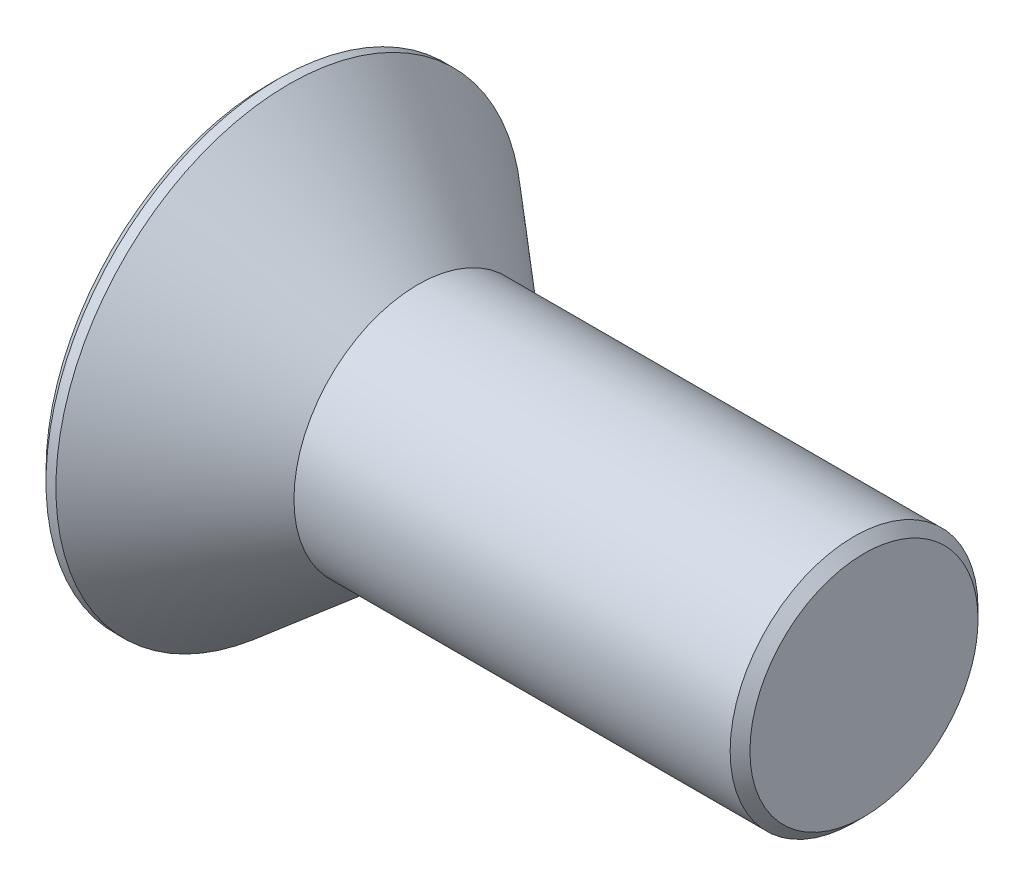
ISO-10303-21;
HEADER;
FILE_DESCRIPTION(('STEP AP214'),'2;1');
FILE_NAME('part.step','',(''),(''),'','','');
FILE_SCHEMA(('AUTOMOTIVE_DESIGN { 1 0 10303 214 1 1 1 1 }'));
ENDSEC;
DATA;
#1=APPLICATION_CONTEXT('core data for automotive mechanical design processes');
#2=APPLICATION_PROTOCOL_DEFINITION('international standard','automotive_design',2000,#1);
#3=PRODUCT_CONTEXT('',#1,'mechanical');
#4=PRODUCT('Part','Part','',(#3));
#5=PRODUCT_RELATED_PRODUCT_CATEGORY('part','',(#4));
#6=PRODUCT_DEFINITION_FORMATION('','',#4);
#7=PRODUCT_DEFINITION_CONTEXT('part definition',#1,'design');
#8=PRODUCT_DEFINITION('design','',#6,#7);
#9=PRODUCT_DEFINITION_SHAPE('','',#8);
#10=(LENGTH_UNIT() NAMED_UNIT(*) SI_UNIT(.MILLI.,.METRE.));
#11=(NAMED_UNIT(*) PLANE_ANGLE_UNIT() SI_UNIT($,.RADIAN.));
#12=(NAMED_UNIT(*) SI_UNIT($,.STERADIAN.) SOLID_ANGLE_UNIT());
#13=UNCERTAINTY_MEASURE_WITH_UNIT(LENGTH_MEASURE(1.E-05),#10,'distance_accuracy_value','');
#14=(GEOMETRIC_REPRESENTATION_CONTEXT(3) GLOBAL_UNCERTAINTY_ASSIGNED_CONTEXT((#13)) GLOBAL_UNIT_ASSIGNED_CONTEXT((#10,
#11,#12)) REPRESENTATION_CONTEXT('',''));
#15=CARTESIAN_POINT('',(0.,0.,0.));
#16=DIRECTION('',(0.,0.,1.));
#17=DIRECTION('',(1.,0.,0.));
#18=AXIS2_PLACEMENT_3D('',#15,#16,#17);
#19=CARTESIAN_POINT('',(1.2,0.,0.));
#20=DIRECTION('',(-1.,0.,0.));
#21=DIRECTION('',(0.,0.,1.));
#22=AXIS2_PLACEMENT_3D('',#19,#20,#21);
#23=PLANE('',#22);
#24=DIRECTION('',(0.,-0.500000000000017,-0.866025403784429));
#25=VECTOR('',#24,1.);
#26=CARTESIAN_POINT('',(1.2,-0.9566987298108,-0.5070508075689));
#27=LINE('',#26,#25);
#28=CARTESIAN_POINT('',(1.2,-0.956698729810804,-0.507050807568898));
#29=VERTEX_POINT('',#28);
#30=CARTESIAN_POINT('',(1.2,-0.736121593216791,-0.125000000000005));
#31=VERTEX_POINT('',#30);
#32=EDGE_CURVE('E1387',#29,#31,#27,.F.);
#33=ORIENTED_EDGE('',*,*,#32,.T.);
#34=CARTESIAN_POINT('',(1.2,-0.9526279441629,0.));
#35=DIRECTION('',(-1.,0.,0.));
#36=DIRECTION('',(0.,0.866025403784429,0.500000000000017));
#37=AXIS2_PLACEMENT_3D('',#34,#35,#36);
#38=CIRCLE('',#37,0.25);
#39=CARTESIAN_POINT('',(1.2,-0.736121593216798,0.125000000000001));
#40=VERTEX_POINT('',#39);
#41=EDGE_CURVE('E387',#40,#31,#38,.T.);
#42=ORIENTED_EDGE('',*,*,#41,.F.);
#43=DIRECTION('',(0.,0.500000000000017,-0.866025403784429));
#44=VECTOR('',#43,1.);
#45=CARTESIAN_POINT('',(1.2,-0.7361215932168,0.125));
#46=LINE('',#45,#44);
#47=CARTESIAN_POINT('',(1.2,-0.956698729810813,0.507050807568892));
#48=VERTEX_POINT('',#47);
#49=EDGE_CURVE('E486',#40,#48,#46,.F.);
#50=ORIENTED_EDGE('',*,*,#49,.T.);
#51=CARTESIAN_POINT('',(1.2,-0.9566987298108,0.5070508075689));
#52=CARTESIAN_POINT('',(1.2,-0.97077699675537,0.532050807568897));
#53=CARTESIAN_POINT('',(1.2,-0.956698729810825,0.557050807568895));
#54=CARTESIAN_POINT('',(1.2,-0.942798125899478,0.581735315907353));
#55=CARTESIAN_POINT('',(1.2,-0.9133974596216,0.5820508075689));
#56=B_SPLINE_CURVE_WITH_KNOTS('',2,(#51,#52,#53,#54,#55),.UNSPECIFIED.,.F.,.F.,(3,2,3),(0.,0.5,
1.),.UNSPECIFIED.);
#57=CARTESIAN_POINT('',(1.2,-0.9133974596216,0.5820508075689));
#58=VERTEX_POINT('',#57);
#59=EDGE_CURVE('E263',#48,#58,#56,.T.);
#60=ORIENTED_EDGE('',*,*,#59,.T.);
#61=DIRECTION('',(0.,1.,0.));
#62=VECTOR('',#61,1.);
#63=CARTESIAN_POINT('',(1.2,-0.9133974596216,0.5820508075689));
#64=LINE('',#63,#62);
#65=CARTESIAN_POINT('',(1.2,-0.4722431864335,0.5820508075689));
#66=VERTEX_POINT('',#65);
#67=EDGE_CURVE('E1399',#58,#66,#64,.T.);
#68=ORIENTED_EDGE('',*,*,#67,.T.);
#69=CARTESIAN_POINT('',(1.2,-0.4722431864335,0.8320508075689));
#70=DIRECTION('',(-1.,0.,0.));
#71=DIRECTION('',(0.,0.866025403784429,-0.500000000000017));
#72=AXIS2_PLACEMENT_3D('',#69,#70,#71);
#73=CIRCLE('',#72,0.25);
#74=CARTESIAN_POINT('',(1.2,-0.255736835487398,0.707050807568899));
#75=VERTEX_POINT('',#74);
#76=EDGE_CURVE('E275',#75,#66,#73,.T.);
#77=ORIENTED_EDGE('',*,*,#76,.F.);
#78=DIRECTION('',(0.,-0.500000000000017,-0.866025403784429));
#79=VECTOR('',#78,1.);
#80=CARTESIAN_POINT('',(1.2,-0.2557368354874,0.7070508075689));
#81=LINE('',#80,#79);
#82=CARTESIAN_POINT('',(1.2,-0.043301270189215,1.075));
#83=VERTEX_POINT('',#82);
#84=EDGE_CURVE('E404',#75,#83,#81,.F.);
#85=ORIENTED_EDGE('',*,*,#84,.T.);
#86=CARTESIAN_POINT('',(1.2,-0.04330127018922,1.075));
#87=CARTESIAN_POINT('',(1.2,-0.028689768566879,1.09969213681523));
#88=CARTESIAN_POINT('',(1.2,0.,1.1));
#89=CARTESIAN_POINT('',(1.2,0.0283277132566949,1.10030397805406));
#90=CARTESIAN_POINT('',(1.2,0.04330127018922,1.075));
#91=B_SPLINE_CURVE_WITH_KNOTS('',2,(#86,#87,#88,#89,#90),.UNSPECIFIED.,.F.,.F.,(3,2,3),(0.,0.5,
1.),.UNSPECIFIED.);
#92=CARTESIAN_POINT('',(1.2,0.0433012701892208,1.075));
#93=VERTEX_POINT('',#92);
#94=EDGE_CURVE('E209',#83,#93,#91,.T.);
#95=ORIENTED_EDGE('',*,*,#94,.T.);
#96=DIRECTION('',(0.,-0.500000000000017,0.866025403784429));
#97=VECTOR('',#96,1.);
#98=CARTESIAN_POINT('',(1.2,0.04330127018922,1.075));
#99=LINE('',#98,#97);
#100=CARTESIAN_POINT('',(1.2,0.255736835487402,0.707050807568901));
#101=VERTEX_POINT('',#100);
#102=EDGE_CURVE('E202',#93,#101,#99,.F.);
#103=ORIENTED_EDGE('',*,*,#102,.T.);
#104=CARTESIAN_POINT('',(1.2,0.4722431864335,0.8320508075689));
#105=DIRECTION('',(-1.,0.,0.));
#106=DIRECTION('',(0.,0.,-1.));
#107=AXIS2_PLACEMENT_3D('',#104,#105,#106);
#108=CIRCLE('',#107,0.25);
#109=CARTESIAN_POINT('',(1.2,0.4722431864335,0.5820508075689));
#110=VERTEX_POINT('',#109);
#111=EDGE_CURVE('E205',#110,#101,#108,.T.);
#112=ORIENTED_EDGE('',*,*,#111,.F.);
#113=DIRECTION('',(0.,1.,0.));
#114=VECTOR('',#113,1.);
#115=CARTESIAN_POINT('',(1.2,0.4722431864335,0.5820508075689));
#116=LINE('',#115,#114);
#117=CARTESIAN_POINT('',(1.2,0.9133974596216,0.5820508075689));
#118=VERTEX_POINT('',#117);
#119=EDGE_CURVE('E780',#110,#118,#116,.T.);
#120=ORIENTED_EDGE('',*,*,#119,.T.);
#121=CARTESIAN_POINT('',(1.2,0.9133974596216,0.5820508075689));
#122=CARTESIAN_POINT('',(1.2,0.942087228188481,0.581742944384133));
#123=CARTESIAN_POINT('',(1.2,0.956698729810822,0.5570508075689));
#124=CARTESIAN_POINT('',(1.2,0.971125839156182,0.532670277284505));
#125=CARTESIAN_POINT('',(1.2,0.9566987298108,0.5070508075689));
#126=B_SPLINE_CURVE_WITH_KNOTS('',2,(#121,#122,#123,#124,#125),.UNSPECIFIED.,.F.,.F.,(3,2,3),
(0.,0.5,1.),.UNSPECIFIED.);
#127=CARTESIAN_POINT('',(1.2,0.956698729810804,0.507050807568898));
#128=VERTEX_POINT('',#127);
#129=EDGE_CURVE('E303',#118,#128,#126,.T.);
#130=ORIENTED_EDGE('',*,*,#129,.T.);
#131=DIRECTION('',(0.,0.500000000000017,0.866025403784429));
#132=VECTOR('',#131,1.);
#133=CARTESIAN_POINT('',(1.2,0.9566987298108,0.5070508075689));
#134=LINE('',#133,#132);
#135=CARTESIAN_POINT('',(1.2,0.736121593216791,0.125000000000005));
#136=VERTEX_POINT('',#135);
#137=EDGE_CURVE('E1350',#128,#136,#134,.F.);
#138=ORIENTED_EDGE('',*,*,#137,.T.);
#139=CARTESIAN_POINT('',(1.2,0.9526279441629,0.));
#140=DIRECTION('',(-1.,0.,0.));
#141=DIRECTION('',(0.,-0.866025403784429,-0.500000000000017));
#142=AXIS2_PLACEMENT_3D('',#139,#140,#141);
#143=CIRCLE('',#142,0.25);
#144=CARTESIAN_POINT('',(1.2,0.736121593216798,-0.125000000000001));
#145=VERTEX_POINT('',#144);
#146=EDGE_CURVE('E315',#145,#136,#143,.T.);
#147=ORIENTED_EDGE('',*,*,#146,.F.);
#148=DIRECTION('',(0.,-0.500000000000017,0.866025403784429));
#149=VECTOR('',#148,1.);
#150=CARTESIAN_POINT('',(1.2,0.7361215932168,-0.125));
#151=LINE('',#150,#149);
#152=CARTESIAN_POINT('',(1.2,0.956698729810813,-0.507050807568892));
#153=VERTEX_POINT('',#152);
#154=EDGE_CURVE('E708',#145,#153,#151,.F.);
#155=ORIENTED_EDGE('',*,*,#154,.T.);
#156=CARTESIAN_POINT('',(1.2,0.9566987298108,-0.5070508075689));
#157=CARTESIAN_POINT('',(1.2,0.97077699675537,-0.532050807568897));
#158=CARTESIAN_POINT('',(1.2,0.956698729810825,-0.557050807568895));
#159=CARTESIAN_POINT('',(1.2,0.942798125899478,-0.581735315907353));
#160=CARTESIAN_POINT('',(1.2,0.9133974596216,-0.5820508075689));
#161=B_SPLINE_CURVE_WITH_KNOTS('',2,(#156,#157,#158,#159,#160),.UNSPECIFIED.,.F.,.F.,(3,2,3),
(0.,0.5,1.),.UNSPECIFIED.);
#162=CARTESIAN_POINT('',(1.2,0.9133974596216,-0.5820508075689));
#163=VERTEX_POINT('',#162);
#164=EDGE_CURVE('E327',#153,#163,#161,.T.);
#165=ORIENTED_EDGE('',*,*,#164,.T.);
#166=DIRECTION('',(0.,1.,0.));
#167=VECTOR('',#166,1.);
#168=CARTESIAN_POINT('',(1.2,0.9133974596216,-0.5820508075689));
#169=LINE('',#168,#167);
#170=CARTESIAN_POINT('',(1.2,0.4722431864335,-0.5820508075689));
#171=VERTEX_POINT('',#170);
#172=EDGE_CURVE('E1363',#163,#171,#169,.F.);
#173=ORIENTED_EDGE('',*,*,#172,.T.);
#174=CARTESIAN_POINT('',(1.2,0.4722431864335,-0.8320508075689));
#175=DIRECTION('',(-1.,0.,0.));
#176=DIRECTION('',(0.,-0.866025403784429,0.500000000000017));
#177=AXIS2_PLACEMENT_3D('',#174,#175,#176);
#178=CIRCLE('',#177,0.25);
#179=CARTESIAN_POINT('',(1.2,0.255736835487398,-0.707050807568899));
#180=VERTEX_POINT('',#179);
#181=EDGE_CURVE('E339',#180,#171,#178,.T.);
#182=ORIENTED_EDGE('',*,*,#181,.F.);
#183=DIRECTION('',(0.,0.500000000000017,0.866025403784429));
#184=VECTOR('',#183,1.);
#185=CARTESIAN_POINT('',(1.2,0.2557368354874,-0.7070508075689));
#186=LINE('',#185,#184);
#187=CARTESIAN_POINT('',(1.2,0.043301270189215,-1.075));
#188=VERTEX_POINT('',#187);
#189=EDGE_CURVE('E634',#180,#188,#186,.F.);
#190=ORIENTED_EDGE('',*,*,#189,.T.);
#191=CARTESIAN_POINT('',(1.2,0.04330127018922,-1.075));
#192=CARTESIAN_POINT('',(1.2,0.028689768566879,-1.09969213681523));
#193=CARTESIAN_POINT('',(1.2,0.,-1.1));
#194=CARTESIAN_POINT('',(1.2,-0.0283277132566949,-1.10030397805406));
#195=CARTESIAN_POINT('',(1.2,-0.04330127018922,-1.075));
#196=B_SPLINE_CURVE_WITH_KNOTS('',2,(#191,#192,#193,#194,#195),.UNSPECIFIED.,.F.,.F.,(3,2,3),
(0.,0.5,1.),.UNSPECIFIED.);
#197=CARTESIAN_POINT('',(1.2,-0.0433012701892204,-1.075));
#198=VERTEX_POINT('',#197);
#199=EDGE_CURVE('E351',#188,#198,#196,.T.);
#200=ORIENTED_EDGE('',*,*,#199,.T.);
#201=DIRECTION('',(0.,0.500000000000017,-0.866025403784429));
#202=VECTOR('',#201,1.);
#203=CARTESIAN_POINT('',(1.2,-0.04330127018922,-1.075));
#204=LINE('',#203,#202);
#205=CARTESIAN_POINT('',(1.2,-0.255736835487402,-0.707050807568901));
#206=VERTEX_POINT('',#205);
#207=EDGE_CURVE('E1375',#198,#206,#204,.F.);
#208=ORIENTED_EDGE('',*,*,#207,.T.);
#209=CARTESIAN_POINT('',(1.2,-0.4722431864335,-0.8320508075689));
#210=DIRECTION('',(-1.,0.,0.));
#211=DIRECTION('',(0.,0.,1.));
#212=AXIS2_PLACEMENT_3D('',#209,#210,#211);
#213=CIRCLE('',#212,0.25);
#214=CARTESIAN_POINT('',(1.2,-0.4722431864335,-0.5820508075689));
#215=VERTEX_POINT('',#214);
#216=EDGE_CURVE('E363',#215,#206,#213,.T.);
#217=ORIENTED_EDGE('',*,*,#216,.F.);
#218=DIRECTION('',(0.,1.,0.));
#219=VECTOR('',#218,1.);
#220=CARTESIAN_POINT('',(1.2,-0.4722431864335,-0.5820508075689));
#221=LINE('',#220,#219);
#222=CARTESIAN_POINT('',(1.2,-0.9133974596216,-0.5820508075689));
#223=VERTEX_POINT('',#222);
#224=EDGE_CURVE('E560',#215,#223,#221,.F.);
#225=ORIENTED_EDGE('',*,*,#224,.T.);
#226=CARTESIAN_POINT('',(1.2,-0.9133974596216,-0.5820508075689));
#227=CARTESIAN_POINT('',(1.2,-0.942087228188481,-0.581742944384133));
#228=CARTESIAN_POINT('',(1.2,-0.956698729810822,-0.5570508075689));
#229=CARTESIAN_POINT('',(1.2,-0.971125839156182,-0.532670277284505));
#230=CARTESIAN_POINT('',(1.2,-0.9566987298108,-0.5070508075689));
#231=B_SPLINE_CURVE_WITH_KNOTS('',2,(#226,#227,#228,#229,#230),.UNSPECIFIED.,.F.,.F.,(3,2,3),
(0.,0.5,1.),.UNSPECIFIED.);
#232=EDGE_CURVE('E375',#223,#29,#231,.T.);
#233=ORIENTED_EDGE('',*,*,#232,.T.);
#234=EDGE_LOOP('',(#33,#42,#50,#60,#68,#77,#85,#95,#103,#112,#120,#130,#138,#147,#155,#165,#173,
#182,#190,#200,#208,#217,#225,#233));
#235=FACE_BOUND('',#234,.T.);
#236=ADVANCED_FACE('F17',(#235),#23,.T.);
#237=CARTESIAN_POINT('',(0.,0.04330127018922,1.075));
#238=DIRECTION('',(0.,0.866025403784429,0.500000000000017));
#239=DIRECTION('',(0.,-0.500000000000017,0.866025403784429));
#240=AXIS2_PLACEMENT_3D('',#237,#238,#239);
#241=PLANE('',#240);
#242=ORIENTED_EDGE('',*,*,#102,.F.);
#243=DIRECTION('',(-1.,0.,0.));
#244=VECTOR('',#243,1.);
#245=CARTESIAN_POINT('',(0.,0.0433012701892215,1.075));
#246=LINE('',#245,#244);
#247=CARTESIAN_POINT('',(0.,0.0433012701892208,1.075));
#248=VERTEX_POINT('',#247);
#249=EDGE_CURVE('E428',#93,#248,#246,.T.);
#250=ORIENTED_EDGE('',*,*,#249,.T.);
#251=DIRECTION('',(0.,0.499999999999963,-0.86602540378446));
#252=VECTOR('',#251,1.);
#253=CARTESIAN_POINT('',(0.,0.04330127018922,1.075));
#254=LINE('',#253,#252);
#255=CARTESIAN_POINT('',(0.,0.255736835487396,0.707050807568898));
#256=VERTEX_POINT('',#255);
#257=EDGE_CURVE('E218',#248,#256,#254,.T.);
#258=ORIENTED_EDGE('',*,*,#257,.T.);
#259=DIRECTION('',(-1.,0.,0.));
#260=VECTOR('',#259,1.);
#261=CARTESIAN_POINT('',(0.,0.255736835487393,0.707050807568896));
#262=LINE('',#261,#260);
#263=EDGE_CURVE('E215',#101,#256,#262,.T.);
#264=ORIENTED_EDGE('',*,*,#263,.F.);
#265=EDGE_LOOP('',(#242,#250,#258,#264));
#266=FACE_BOUND('',#265,.T.);
#267=ADVANCED_FACE('F216',(#266),#241,.F.);
#268=CARTESIAN_POINT('',(0.,0.4722431864335,0.8320508075689));
#269=DIRECTION('',(-1.,0.,0.));
#270=DIRECTION('',(0.,0.,1.));
#271=AXIS2_PLACEMENT_3D('',#268,#269,#270);
#272=CYLINDRICAL_SURFACE('',#271,0.25);
#273=ORIENTED_EDGE('',*,*,#263,.T.);
#274=CARTESIAN_POINT('',(0.,0.4722431864335,0.8320508075689));
#275=DIRECTION('',(1.,0.,0.));
#276=DIRECTION('',(0.,-0.866025403784429,-0.500000000000017));
#277=AXIS2_PLACEMENT_3D('',#274,#275,#276);
#278=CIRCLE('',#277,0.25);
#279=CARTESIAN_POINT('',(0.,0.4722431864335,0.5820508075689));
#280=VERTEX_POINT('',#279);
#281=EDGE_CURVE('E980',#256,#280,#278,.T.);
#282=ORIENTED_EDGE('',*,*,#281,.T.);
#283=DIRECTION('',(1.,0.,0.));
#284=VECTOR('',#283,1.);
#285=CARTESIAN_POINT('',(0.,0.4722431864335,0.5820508075689));
#286=LINE('',#285,#284);
#287=EDGE_CURVE('E221',#280,#110,#286,.T.);
#288=ORIENTED_EDGE('',*,*,#287,.T.);
#289=ORIENTED_EDGE('',*,*,#111,.T.);
#290=EDGE_LOOP('',(#273,#282,#288,#289));
#291=FACE_BOUND('',#290,.T.);
#292=ADVANCED_FACE('F224',(#291),#272,.T.);
#293=CARTESIAN_POINT('',(0.,0.4722431864335,0.5820508075689));
#294=DIRECTION('',(0.,0.,1.));
#295=DIRECTION('',(1.,0.,0.));
#296=AXIS2_PLACEMENT_3D('',#293,#294,#295);
#297=PLANE('',#296);
#298=ORIENTED_EDGE('',*,*,#119,.F.);
#299=ORIENTED_EDGE('',*,*,#287,.F.);
#300=DIRECTION('',(0.,1.,0.));
#301=VECTOR('',#300,1.);
#302=CARTESIAN_POINT('',(0.,0.,0.5820508075689));
#303=LINE('',#302,#301);
#304=CARTESIAN_POINT('',(0.,0.9133974596216,0.5820508075689));
#305=VERTEX_POINT('',#304);
#306=EDGE_CURVE('E809',#280,#305,#303,.T.);
#307=ORIENTED_EDGE('',*,*,#306,.T.);
#308=DIRECTION('',(-1.,0.,0.));
#309=VECTOR('',#308,1.);
#310=CARTESIAN_POINT('',(0.,0.9133974596216,0.5820508075689));
#311=LINE('',#310,#309);
#312=EDGE_CURVE('E796',#305,#118,#311,.F.);
#313=ORIENTED_EDGE('',*,*,#312,.T.);
#314=EDGE_LOOP('',(#298,#299,#307,#313));
#315=FACE_BOUND('',#314,.T.);
#316=ADVANCED_FACE('F243',(#315),#297,.F.);
#317=CARTESIAN_POINT('',(0.,0.9133974596216,0.5320508075689));
#318=DIRECTION('',(-1.,0.,0.));
#319=DIRECTION('',(0.,0.,1.));
#320=AXIS2_PLACEMENT_3D('',#317,#318,#319);
#321=CYLINDRICAL_SURFACE('',#320,0.05);
#322=ORIENTED_EDGE('',*,*,#129,.F.);
#323=ORIENTED_EDGE('',*,*,#312,.F.);
#324=CARTESIAN_POINT('',(0.,0.9133974596216,0.5320508075689));
#325=DIRECTION('',(-1.,0.,0.));
#326=DIRECTION('',(0.,0.,1.));
#327=AXIS2_PLACEMENT_3D('',#324,#325,#326);
#328=CIRCLE('',#327,0.05);
#329=CARTESIAN_POINT('',(0.,0.956698729810804,0.507050807568898));
#330=VERTEX_POINT('',#329);
#331=EDGE_CURVE('E811',#305,#330,#328,.T.);
#332=ORIENTED_EDGE('',*,*,#331,.T.);
#333=DIRECTION('',(1.,0.,0.));
#334=VECTOR('',#333,1.);
#335=CARTESIAN_POINT('',(0.,0.9566987298108,0.5070508075689));
#336=LINE('',#335,#334);
#337=EDGE_CURVE('E1351',#330,#128,#336,.T.);
#338=ORIENTED_EDGE('',*,*,#337,.T.);
#339=EDGE_LOOP('',(#322,#323,#332,#338));
#340=FACE_BOUND('',#339,.T.);
#341=ADVANCED_FACE('F781',(#340),#321,.F.);
#342=CARTESIAN_POINT('',(0.,0.9566987298108,0.5070508075689));
#343=DIRECTION('',(0.,0.866025403784429,-0.500000000000017));
#344=DIRECTION('',(0.,0.500000000000017,0.866025403784429));
#345=AXIS2_PLACEMENT_3D('',#342,#343,#344);
#346=PLANE('',#345);
#347=ORIENTED_EDGE('',*,*,#137,.F.);
#348=ORIENTED_EDGE('',*,*,#337,.F.);
#349=DIRECTION('',(0.,-0.499999999999969,-0.866025403784457));
#350=VECTOR('',#349,1.);
#351=CARTESIAN_POINT('',(0.,0.9566987298108,0.5070508075689));
#352=LINE('',#351,#350);
#353=CARTESIAN_POINT('',(0.,0.736121593216796,0.125000000000002));
#354=VERTEX_POINT('',#353);
#355=EDGE_CURVE('E818',#330,#354,#352,.T.);
#356=ORIENTED_EDGE('',*,*,#355,.T.);
#357=DIRECTION('',(-1.,0.,0.));
#358=VECTOR('',#357,1.);
#359=CARTESIAN_POINT('',(0.,0.736121593216793,0.125000000000004));
#360=LINE('',#359,#358);
#361=EDGE_CURVE('E740',#136,#354,#360,.T.);
#362=ORIENTED_EDGE('',*,*,#361,.F.);
#363=EDGE_LOOP('',(#347,#348,#356,#362));
#364=FACE_BOUND('',#363,.T.);
#365=ADVANCED_FACE('F762',(#364),#346,.F.);
#366=CARTESIAN_POINT('',(0.,0.9526279441629,0.));
#367=DIRECTION('',(-1.,0.,0.));
#368=DIRECTION('',(0.,0.,1.));
#369=AXIS2_PLACEMENT_3D('',#366,#367,#368);
#370=CYLINDRICAL_SURFACE('',#369,0.25);
#371=ORIENTED_EDGE('',*,*,#361,.T.);
#372=CARTESIAN_POINT('',(0.,0.9526279441629,0.));
#373=DIRECTION('',(1.,0.,0.));
#374=DIRECTION('',(0.,-0.866025403784429,0.500000000000016));
#375=AXIS2_PLACEMENT_3D('',#372,#373,#374);
#376=CIRCLE('',#375,0.25);
#377=CARTESIAN_POINT('',(0.,0.736121593216798,-0.125000000000001));
#378=VERTEX_POINT('',#377);
#379=EDGE_CURVE('E747',#354,#378,#376,.T.);
#380=ORIENTED_EDGE('',*,*,#379,.T.);
#381=DIRECTION('',(1.,0.,0.));
#382=VECTOR('',#381,1.);
#383=CARTESIAN_POINT('',(0.,0.7361215932168,-0.125));
#384=LINE('',#383,#382);
#385=EDGE_CURVE('E738',#378,#145,#384,.T.);
#386=ORIENTED_EDGE('',*,*,#385,.T.);
#387=ORIENTED_EDGE('',*,*,#146,.T.);
#388=EDGE_LOOP('',(#371,#380,#386,#387));
#389=FACE_BOUND('',#388,.T.);
#390=ADVANCED_FACE('F753',(#389),#370,.T.);
#391=CARTESIAN_POINT('',(0.,0.7361215932168,-0.125));
#392=DIRECTION('',(0.,0.866025403784429,0.500000000000017));
#393=DIRECTION('',(0.,-0.500000000000017,0.866025403784429));
#394=AXIS2_PLACEMENT_3D('',#391,#392,#393);
#395=PLANE('',#394);
#396=ORIENTED_EDGE('',*,*,#154,.F.);
#397=ORIENTED_EDGE('',*,*,#385,.F.);
#398=DIRECTION('',(0.,0.499999999999969,-0.866025403784457));
#399=VECTOR('',#398,1.);
#400=CARTESIAN_POINT('',(0.,0.7361215932168,-0.125));
#401=LINE('',#400,#399);
#402=CARTESIAN_POINT('',(0.,0.956698729810808,-0.507050807568895));
#403=VERTEX_POINT('',#402);
#404=EDGE_CURVE('E972',#378,#403,#401,.T.);
#405=ORIENTED_EDGE('',*,*,#404,.T.);
#406=DIRECTION('',(-1.,0.,0.));
#407=VECTOR('',#406,1.);
#408=CARTESIAN_POINT('',(0.,0.956698729810816,-0.50705080756889));
#409=LINE('',#408,#407);
#410=EDGE_CURVE('E728',#403,#153,#409,.F.);
#411=ORIENTED_EDGE('',*,*,#410,.T.);
#412=EDGE_LOOP('',(#396,#397,#405,#411));
#413=FACE_BOUND('',#412,.T.);
#414=ADVANCED_FACE('F719',(#413),#395,.F.);
#415=CARTESIAN_POINT('',(0.,0.9133974596216,-0.5320508075689));
#416=DIRECTION('',(-1.,0.,0.));
#417=DIRECTION('',(0.,0.,1.));
#418=AXIS2_PLACEMENT_3D('',#415,#416,#417);
#419=CYLINDRICAL_SURFACE('',#418,0.05);
#420=ORIENTED_EDGE('',*,*,#164,.F.);
#421=ORIENTED_EDGE('',*,*,#410,.F.);
#422=CARTESIAN_POINT('',(0.,0.9133974596216,-0.5320508075689));
#423=DIRECTION('',(-1.,0.,0.));
#424=DIRECTION('',(0.,0.866025403784328,0.500000000000192));
#425=AXIS2_PLACEMENT_3D('',#422,#423,#424);
#426=CIRCLE('',#425,0.05);
#427=CARTESIAN_POINT('',(0.,0.9133974596216,-0.5820508075689));
#428=VERTEX_POINT('',#427);
#429=EDGE_CURVE('E845',#403,#428,#426,.T.);
#430=ORIENTED_EDGE('',*,*,#429,.T.);
#431=DIRECTION('',(-1.,0.,0.));
#432=VECTOR('',#431,1.);
#433=CARTESIAN_POINT('',(0.,0.9133974596216,-0.5820508075689));
#434=LINE('',#433,#432);
#435=EDGE_CURVE('E1360',#428,#163,#434,.F.);
#436=ORIENTED_EDGE('',*,*,#435,.T.);
#437=EDGE_LOOP('',(#420,#421,#430,#436));
#438=FACE_BOUND('',#437,.T.);
#439=ADVANCED_FACE('F710',(#438),#419,.F.);
#440=CARTESIAN_POINT('',(0.,0.9133974596216,-0.5820508075689));
#441=DIRECTION('',(0.,0.,-1.));
#442=DIRECTION('',(-1.,0.,0.));
#443=AXIS2_PLACEMENT_3D('',#440,#441,#442);
#444=PLANE('',#443);
#445=ORIENTED_EDGE('',*,*,#172,.F.);
#446=ORIENTED_EDGE('',*,*,#435,.F.);
#447=DIRECTION('',(0.,1.,0.));
#448=VECTOR('',#447,1.);
#449=CARTESIAN_POINT('',(0.,0.,-0.5820508075689));
#450=LINE('',#449,#448);
#451=CARTESIAN_POINT('',(0.,0.4722431864335,-0.5820508075689));
#452=VERTEX_POINT('',#451);
#453=EDGE_CURVE('E968',#428,#452,#450,.F.);
#454=ORIENTED_EDGE('',*,*,#453,.T.);
#455=DIRECTION('',(-1.,0.,0.));
#456=VECTOR('',#455,1.);
#457=CARTESIAN_POINT('',(0.,0.4722431864335,-0.5820508075689));
#458=LINE('',#457,#456);
#459=EDGE_CURVE('E666',#171,#452,#458,.T.);
#460=ORIENTED_EDGE('',*,*,#459,.F.);
#461=EDGE_LOOP('',(#445,#446,#454,#460));
#462=FACE_BOUND('',#461,.T.);
#463=ADVANCED_FACE('F688',(#462),#444,.F.);
#464=CARTESIAN_POINT('',(0.,0.4722431864335,-0.8320508075689));
#465=DIRECTION('',(-1.,0.,0.));
#466=DIRECTION('',(0.,0.,1.));
#467=AXIS2_PLACEMENT_3D('',#464,#465,#466);
#468=CYLINDRICAL_SURFACE('',#467,0.25);
#469=ORIENTED_EDGE('',*,*,#459,.T.);
#470=CARTESIAN_POINT('',(0.,0.4722431864335,-0.8320508075689));
#471=DIRECTION('',(1.,0.,0.));
#472=DIRECTION('',(0.,0.,1.));
#473=AXIS2_PLACEMENT_3D('',#470,#471,#472);
#474=CIRCLE('',#473,0.25);
#475=CARTESIAN_POINT('',(0.,0.255736835487398,-0.707050807568899));
#476=VERTEX_POINT('',#475);
#477=EDGE_CURVE('E673',#452,#476,#474,.T.);
#478=ORIENTED_EDGE('',*,*,#477,.T.);
#479=DIRECTION('',(1.,0.,0.));
#480=VECTOR('',#479,1.);
#481=CARTESIAN_POINT('',(0.,0.2557368354874,-0.7070508075689));
#482=LINE('',#481,#480);
#483=EDGE_CURVE('E664',#476,#180,#482,.T.);
#484=ORIENTED_EDGE('',*,*,#483,.T.);
#485=ORIENTED_EDGE('',*,*,#181,.T.);
#486=EDGE_LOOP('',(#469,#478,#484,#485));
#487=FACE_BOUND('',#486,.T.);
#488=ADVANCED_FACE('F679',(#487),#468,.T.);
#489=CARTESIAN_POINT('',(0.,0.2557368354874,-0.7070508075689));
#490=DIRECTION('',(0.,0.866025403784429,-0.500000000000017));
#491=DIRECTION('',(0.,0.500000000000017,0.866025403784429));
#492=AXIS2_PLACEMENT_3D('',#489,#490,#491);
#493=PLANE('',#492);
#494=ORIENTED_EDGE('',*,*,#189,.F.);
#495=ORIENTED_EDGE('',*,*,#483,.F.);
#496=DIRECTION('',(0.,-0.499999999999963,-0.86602540378446));
#497=VECTOR('',#496,1.);
#498=CARTESIAN_POINT('',(0.,0.2557368354874,-0.7070508075689));
#499=LINE('',#498,#497);
#500=CARTESIAN_POINT('',(0.,0.0433012701892208,-1.075));
#501=VERTEX_POINT('',#500);
#502=EDGE_CURVE('E964',#476,#501,#499,.T.);
#503=ORIENTED_EDGE('',*,*,#502,.T.);
#504=DIRECTION('',(-1.,0.,0.));
#505=VECTOR('',#504,1.);
#506=CARTESIAN_POINT('',(0.,0.0433012701892215,-1.075));
#507=LINE('',#506,#505);
#508=EDGE_CURVE('E654',#501,#188,#507,.F.);
#509=ORIENTED_EDGE('',*,*,#508,.T.);
#510=EDGE_LOOP('',(#494,#495,#503,#509));
#511=FACE_BOUND('',#510,.T.);
#512=ADVANCED_FACE('F645',(#511),#493,.F.);
#513=CARTESIAN_POINT('',(0.,0.,-1.05));
#514=DIRECTION('',(-1.,0.,0.));
#515=DIRECTION('',(0.,0.,1.));
#516=AXIS2_PLACEMENT_3D('',#513,#514,#515);
#517=CYLINDRICAL_SURFACE('',#516,0.05);
#518=ORIENTED_EDGE('',*,*,#199,.F.);
#519=ORIENTED_EDGE('',*,*,#508,.F.);
#520=CARTESIAN_POINT('',(0.,0.,-1.05));
#521=DIRECTION('',(-1.,0.,0.));
#522=DIRECTION('',(0.,0.86602540378443,-0.500000000000014));
#523=AXIS2_PLACEMENT_3D('',#520,#521,#522);
#524=CIRCLE('',#523,0.05);
#525=CARTESIAN_POINT('',(0.,-0.0433012701892204,-1.075));
#526=VERTEX_POINT('',#525);
#527=EDGE_CURVE('E867',#501,#526,#524,.T.);
#528=ORIENTED_EDGE('',*,*,#527,.T.);
#529=DIRECTION('',(1.,0.,0.));
#530=VECTOR('',#529,1.);
#531=CARTESIAN_POINT('',(0.,-0.04330127018922,-1.075));
#532=LINE('',#531,#530);
#533=EDGE_CURVE('E1372',#526,#198,#532,.T.);
#534=ORIENTED_EDGE('',*,*,#533,.T.);
#535=EDGE_LOOP('',(#518,#519,#528,#534));
#536=FACE_BOUND('',#535,.T.);
#537=ADVANCED_FACE('F636',(#536),#517,.F.);
#538=CARTESIAN_POINT('',(0.,-0.04330127018922,-1.075));
#539=DIRECTION('',(0.,-0.866025403784429,-0.500000000000017));
#540=DIRECTION('',(0.,0.500000000000017,-0.866025403784429));
#541=AXIS2_PLACEMENT_3D('',#538,#539,#540);
#542=PLANE('',#541);
#543=ORIENTED_EDGE('',*,*,#207,.F.);
#544=ORIENTED_EDGE('',*,*,#533,.F.);
#545=DIRECTION('',(0.,-0.499999999999963,0.86602540378446));
#546=VECTOR('',#545,1.);
#547=CARTESIAN_POINT('',(0.,-0.04330127018922,-1.075));
#548=LINE('',#547,#546);
#549=CARTESIAN_POINT('',(0.,-0.255736835487396,-0.707050807568898));
#550=VERTEX_POINT('',#549);
#551=EDGE_CURVE('E960',#526,#550,#548,.T.);
#552=ORIENTED_EDGE('',*,*,#551,.T.);
#553=DIRECTION('',(-1.,0.,0.));
#554=VECTOR('',#553,1.);
#555=CARTESIAN_POINT('',(0.,-0.255736835487393,-0.707050807568896));
#556=LINE('',#555,#554);
#557=EDGE_CURVE('E592',#206,#550,#556,.T.);
#558=ORIENTED_EDGE('',*,*,#557,.F.);
#559=EDGE_LOOP('',(#543,#544,#552,#558));
#560=FACE_BOUND('',#559,.T.);
#561=ADVANCED_FACE('F614',(#560),#542,.F.);
#562=CARTESIAN_POINT('',(0.,-0.4722431864335,-0.8320508075689));
#563=DIRECTION('',(-1.,0.,0.));
#564=DIRECTION('',(0.,0.,1.));
#565=AXIS2_PLACEMENT_3D('',#562,#563,#564);
#566=CYLINDRICAL_SURFACE('',#565,0.25);
#567=ORIENTED_EDGE('',*,*,#557,.T.);
#568=CARTESIAN_POINT('',(0.,-0.4722431864335,-0.8320508075689));
#569=DIRECTION('',(1.,0.,0.));
#570=DIRECTION('',(0.,0.866025403784429,0.500000000000017));
#571=AXIS2_PLACEMENT_3D('',#568,#569,#570);
#572=CIRCLE('',#571,0.25);
#573=CARTESIAN_POINT('',(0.,-0.4722431864335,-0.5820508075689));
#574=VERTEX_POINT('',#573);
#575=EDGE_CURVE('E599',#550,#574,#572,.T.);
#576=ORIENTED_EDGE('',*,*,#575,.T.);
#577=DIRECTION('',(-1.,0.,0.));
#578=VECTOR('',#577,1.);
#579=CARTESIAN_POINT('',(0.,-0.4722431864335,-0.5820508075689));
#580=LINE('',#579,#578);
#581=EDGE_CURVE('E590',#574,#215,#580,.F.);
#582=ORIENTED_EDGE('',*,*,#581,.T.);
#583=ORIENTED_EDGE('',*,*,#216,.T.);
#584=EDGE_LOOP('',(#567,#576,#582,#583));
#585=FACE_BOUND('',#584,.T.);
#586=ADVANCED_FACE('F605',(#585),#566,.T.);
#587=CARTESIAN_POINT('',(0.,-0.4722431864335,-0.5820508075689));
#588=DIRECTION('',(0.,0.,-1.));
#589=DIRECTION('',(-1.,0.,0.));
#590=AXIS2_PLACEMENT_3D('',#587,#588,#589);
#591=PLANE('',#590);
#592=ORIENTED_EDGE('',*,*,#224,.F.);
#593=ORIENTED_EDGE('',*,*,#581,.F.);
#594=DIRECTION('',(0.,1.,0.));
#595=VECTOR('',#594,1.);
#596=CARTESIAN_POINT('',(0.,0.,-0.5820508075689));
#597=LINE('',#596,#595);
#598=CARTESIAN_POINT('',(0.,-0.9133974596216,-0.5820508075689));
#599=VERTEX_POINT('',#598);
#600=EDGE_CURVE('E956',#574,#599,#597,.F.);
#601=ORIENTED_EDGE('',*,*,#600,.T.);
#602=DIRECTION('',(-1.,0.,0.));
#603=VECTOR('',#602,1.);
#604=CARTESIAN_POINT('',(0.,-0.9133974596216,-0.5820508075689));
#605=LINE('',#604,#603);
#606=EDGE_CURVE('E580',#599,#223,#605,.F.);
#607=ORIENTED_EDGE('',*,*,#606,.T.);
#608=EDGE_LOOP('',(#592,#593,#601,#607));
#609=FACE_BOUND('',#608,.T.);
#610=ADVANCED_FACE('F571',(#609),#591,.F.);
#611=CARTESIAN_POINT('',(0.,-0.9133974596216,-0.5320508075689));
#612=DIRECTION('',(-1.,0.,0.));
#613=DIRECTION('',(0.,0.,1.));
#614=AXIS2_PLACEMENT_3D('',#611,#612,#613);
#615=CYLINDRICAL_SURFACE('',#614,0.05);
#616=ORIENTED_EDGE('',*,*,#232,.F.);
#617=ORIENTED_EDGE('',*,*,#606,.F.);
#618=CARTESIAN_POINT('',(0.,-0.9133974596216,-0.5320508075689));
#619=DIRECTION('',(-1.,0.,0.));
#620=DIRECTION('',(0.,0.,-1.));
#621=AXIS2_PLACEMENT_3D('',#618,#619,#620);
#622=CIRCLE('',#621,0.05);
#623=CARTESIAN_POINT('',(0.,-0.956698729810804,-0.507050807568898));
#624=VERTEX_POINT('',#623);
#625=EDGE_CURVE('E889',#599,#624,#622,.T.);
#626=ORIENTED_EDGE('',*,*,#625,.T.);
#627=DIRECTION('',(1.,0.,0.));
#628=VECTOR('',#627,1.);
#629=CARTESIAN_POINT('',(0.,-0.9566987298108,-0.5070508075689));
#630=LINE('',#629,#628);
#631=EDGE_CURVE('E1384',#624,#29,#630,.T.);
#632=ORIENTED_EDGE('',*,*,#631,.T.);
#633=EDGE_LOOP('',(#616,#617,#626,#632));
#634=FACE_BOUND('',#633,.T.);
#635=ADVANCED_FACE('F562',(#634),#615,.F.);
#636=CARTESIAN_POINT('',(0.,-0.9566987298108,-0.5070508075689));
#637=DIRECTION('',(0.,-0.866025403784429,0.500000000000017));
#638=DIRECTION('',(0.,-0.500000000000017,-0.866025403784429));
#639=AXIS2_PLACEMENT_3D('',#636,#637,#638);
#640=PLANE('',#639);
#641=ORIENTED_EDGE('',*,*,#32,.F.);
#642=ORIENTED_EDGE('',*,*,#631,.F.);
#643=DIRECTION('',(0.,0.499999999999969,0.866025403784457));
#644=VECTOR('',#643,1.);
#645=CARTESIAN_POINT('',(0.,-0.9566987298108,-0.5070508075689));
#646=LINE('',#645,#644);
#647=CARTESIAN_POINT('',(0.,-0.736121593216796,-0.125000000000002));
#648=VERTEX_POINT('',#647);
#649=EDGE_CURVE('E952',#624,#648,#646,.T.);
#650=ORIENTED_EDGE('',*,*,#649,.T.);
#651=DIRECTION('',(-1.,0.,0.));
#652=VECTOR('',#651,1.);
#653=CARTESIAN_POINT('',(0.,-0.736121593216793,-0.125000000000004));
#654=LINE('',#653,#652);
#655=EDGE_CURVE('E518',#31,#648,#654,.T.);
#656=ORIENTED_EDGE('',*,*,#655,.F.);
#657=EDGE_LOOP('',(#641,#642,#650,#656));
#658=FACE_BOUND('',#657,.T.);
#659=ADVANCED_FACE('F540',(#658),#640,.F.);
#660=CARTESIAN_POINT('',(0.,-0.9526279441629,0.));
#661=DIRECTION('',(-1.,0.,0.));
#662=DIRECTION('',(0.,0.,1.));
#663=AXIS2_PLACEMENT_3D('',#660,#661,#662);
#664=CYLINDRICAL_SURFACE('',#663,0.25);
#665=ORIENTED_EDGE('',*,*,#655,.T.);
#666=CARTESIAN_POINT('',(0.,-0.9526279441629,0.));
#667=DIRECTION('',(1.,0.,0.));
#668=DIRECTION('',(0.,0.866025403784429,-0.500000000000017));
#669=AXIS2_PLACEMENT_3D('',#666,#667,#668);
#670=CIRCLE('',#669,0.25);
#671=CARTESIAN_POINT('',(0.,-0.736121593216798,0.125000000000001));
#672=VERTEX_POINT('',#671);
#673=EDGE_CURVE('E525',#648,#672,#670,.T.);
#674=ORIENTED_EDGE('',*,*,#673,.T.);
#675=DIRECTION('',(1.,0.,0.));
#676=VECTOR('',#675,1.);
#677=CARTESIAN_POINT('',(0.,-0.7361215932168,0.125));
#678=LINE('',#677,#676);
#679=EDGE_CURVE('E516',#672,#40,#678,.T.);
#680=ORIENTED_EDGE('',*,*,#679,.T.);
#681=ORIENTED_EDGE('',*,*,#41,.T.);
#682=EDGE_LOOP('',(#665,#674,#680,#681));
#683=FACE_BOUND('',#682,.T.);
#684=ADVANCED_FACE('F531',(#683),#664,.T.);
#685=CARTESIAN_POINT('',(0.,-0.7361215932168,0.125));
#686=DIRECTION('',(0.,-0.866025403784429,-0.500000000000017));
#687=DIRECTION('',(0.,0.500000000000017,-0.866025403784429));
#688=AXIS2_PLACEMENT_3D('',#685,#686,#687);
#689=PLANE('',#688);
#690=ORIENTED_EDGE('',*,*,#49,.F.);
#691=ORIENTED_EDGE('',*,*,#679,.F.);
#692=DIRECTION('',(0.,-0.499999999999969,0.866025403784457));
#693=VECTOR('',#692,1.);
#694=CARTESIAN_POINT('',(0.,-0.7361215932168,0.125));
#695=LINE('',#694,#693);
#696=CARTESIAN_POINT('',(0.,-0.956698729810808,0.507050807568895));
#697=VERTEX_POINT('',#696);
#698=EDGE_CURVE('E948',#672,#697,#695,.T.);
#699=ORIENTED_EDGE('',*,*,#698,.T.);
#700=DIRECTION('',(-1.,0.,0.));
#701=VECTOR('',#700,1.);
#702=CARTESIAN_POINT('',(0.,-0.956698729810816,0.50705080756889));
#703=LINE('',#702,#701);
#704=EDGE_CURVE('E506',#697,#48,#703,.F.);
#705=ORIENTED_EDGE('',*,*,#704,.T.);
#706=EDGE_LOOP('',(#690,#691,#699,#705));
#707=FACE_BOUND('',#706,.T.);
#708=ADVANCED_FACE('F497',(#707),#689,.F.);
#709=CARTESIAN_POINT('',(0.,-0.9133974596216,0.5320508075689));
#710=DIRECTION('',(-1.,0.,0.));
#711=DIRECTION('',(0.,0.,1.));
#712=AXIS2_PLACEMENT_3D('',#709,#710,#711);
#713=CYLINDRICAL_SURFACE('',#712,0.05);
#714=ORIENTED_EDGE('',*,*,#59,.F.);
#715=ORIENTED_EDGE('',*,*,#704,.F.);
#716=CARTESIAN_POINT('',(0.,-0.9133974596216,0.5320508075689));
#717=DIRECTION('',(-1.,0.,0.));
#718=DIRECTION('',(0.,-0.866025403784328,-0.500000000000192));
#719=AXIS2_PLACEMENT_3D('',#716,#717,#718);
#720=CIRCLE('',#719,0.05);
#721=CARTESIAN_POINT('',(0.,-0.9133974596216,0.5820508075689));
#722=VERTEX_POINT('',#721);
#723=EDGE_CURVE('E911',#697,#722,#720,.T.);
#724=ORIENTED_EDGE('',*,*,#723,.T.);
#725=DIRECTION('',(1.,0.,0.));
#726=VECTOR('',#725,1.);
#727=CARTESIAN_POINT('',(0.,-0.9133974596216,0.5820508075689));
#728=LINE('',#727,#726);
#729=EDGE_CURVE('E1396',#722,#58,#728,.T.);
#730=ORIENTED_EDGE('',*,*,#729,.T.);
#731=EDGE_LOOP('',(#714,#715,#724,#730));
#732=FACE_BOUND('',#731,.T.);
#733=ADVANCED_FACE('F488',(#732),#713,.F.);
#734=CARTESIAN_POINT('',(0.,-0.9133974596216,0.5820508075689));
#735=DIRECTION('',(0.,0.,1.));
#736=DIRECTION('',(1.,0.,0.));
#737=AXIS2_PLACEMENT_3D('',#734,#735,#736);
#738=PLANE('',#737);
#739=ORIENTED_EDGE('',*,*,#67,.F.);
#740=ORIENTED_EDGE('',*,*,#729,.F.);
#741=DIRECTION('',(0.,1.,0.));
#742=VECTOR('',#741,1.);
#743=CARTESIAN_POINT('',(0.,0.,0.5820508075689));
#744=LINE('',#743,#742);
#745=CARTESIAN_POINT('',(0.,-0.4722431864335,0.5820508075689));
#746=VERTEX_POINT('',#745);
#747=EDGE_CURVE('E944',#722,#746,#744,.T.);
#748=ORIENTED_EDGE('',*,*,#747,.T.);
#749=DIRECTION('',(-1.,0.,0.));
#750=VECTOR('',#749,1.);
#751=CARTESIAN_POINT('',(0.,-0.4722431864335,0.5820508075689));
#752=LINE('',#751,#750);
#753=EDGE_CURVE('E444',#66,#746,#752,.T.);
#754=ORIENTED_EDGE('',*,*,#753,.F.);
#755=EDGE_LOOP('',(#739,#740,#748,#754));
#756=FACE_BOUND('',#755,.T.);
#757=ADVANCED_FACE('F466',(#756),#738,.F.);
#758=CARTESIAN_POINT('',(0.,-0.4722431864335,0.8320508075689));
#759=DIRECTION('',(-1.,0.,0.));
#760=DIRECTION('',(0.,0.,1.));
#761=AXIS2_PLACEMENT_3D('',#758,#759,#760);
#762=CYLINDRICAL_SURFACE('',#761,0.25);
#763=ORIENTED_EDGE('',*,*,#753,.T.);
#764=CARTESIAN_POINT('',(0.,-0.4722431864335,0.8320508075689));
#765=DIRECTION('',(1.,0.,0.));
#766=DIRECTION('',(0.,0.,-1.));
#767=AXIS2_PLACEMENT_3D('',#764,#765,#766);
#768=CIRCLE('',#767,0.25);
#769=CARTESIAN_POINT('',(0.,-0.255736835487398,0.707050807568899));
#770=VERTEX_POINT('',#769);
#771=EDGE_CURVE('E451',#746,#770,#768,.T.);
#772=ORIENTED_EDGE('',*,*,#771,.T.);
#773=DIRECTION('',(1.,0.,0.));
#774=VECTOR('',#773,1.);
#775=CARTESIAN_POINT('',(0.,-0.2557368354874,0.7070508075689));
#776=LINE('',#775,#774);
#777=EDGE_CURVE('E442',#770,#75,#776,.T.);
#778=ORIENTED_EDGE('',*,*,#777,.T.);
#779=ORIENTED_EDGE('',*,*,#76,.T.);
#780=EDGE_LOOP('',(#763,#772,#778,#779));
#781=FACE_BOUND('',#780,.T.);
#782=ADVANCED_FACE('F457',(#781),#762,.T.);
#783=CARTESIAN_POINT('',(0.,-0.2557368354874,0.7070508075689));
#784=DIRECTION('',(0.,-0.866025403784429,0.500000000000017));
#785=DIRECTION('',(0.,-0.500000000000017,-0.866025403784429));
#786=AXIS2_PLACEMENT_3D('',#783,#784,#785);
#787=PLANE('',#786);
#788=ORIENTED_EDGE('',*,*,#84,.F.);
#789=ORIENTED_EDGE('',*,*,#777,.F.);
#790=DIRECTION('',(0.,0.499999999999963,0.86602540378446));
#791=VECTOR('',#790,1.);
#792=CARTESIAN_POINT('',(0.,-0.2557368354874,0.7070508075689));
#793=LINE('',#792,#791);
#794=CARTESIAN_POINT('',(0.,-0.0433012701892208,1.075));
#795=VERTEX_POINT('',#794);
#796=EDGE_CURVE('E935',#770,#795,#793,.T.);
#797=ORIENTED_EDGE('',*,*,#796,.T.);
#798=DIRECTION('',(-1.,0.,0.));
#799=VECTOR('',#798,1.);
#800=CARTESIAN_POINT('',(0.,-0.0433012701892215,1.075));
#801=LINE('',#800,#799);
#802=EDGE_CURVE('E437',#795,#83,#801,.F.);
#803=ORIENTED_EDGE('',*,*,#802,.T.);
#804=EDGE_LOOP('',(#788,#789,#797,#803));
#805=FACE_BOUND('',#804,.T.);
#806=ADVANCED_FACE('F417',(#805),#787,.F.);
#807=CARTESIAN_POINT('',(0.,0.,1.05));
#808=DIRECTION('',(-1.,0.,0.));
#809=DIRECTION('',(0.,0.,1.));
#810=AXIS2_PLACEMENT_3D('',#807,#808,#809);
#811=CYLINDRICAL_SURFACE('',#810,0.05);
#812=ORIENTED_EDGE('',*,*,#94,.F.);
#813=ORIENTED_EDGE('',*,*,#802,.F.);
#814=CARTESIAN_POINT('',(0.,0.,1.05));
#815=DIRECTION('',(-1.,0.,0.));
#816=DIRECTION('',(0.,-0.86602540378443,0.500000000000014));
#817=AXIS2_PLACEMENT_3D('',#814,#815,#816);
#818=CIRCLE('',#817,0.05);
#819=EDGE_CURVE('E931',#795,#248,#818,.T.);
#820=ORIENTED_EDGE('',*,*,#819,.T.);
#821=ORIENTED_EDGE('',*,*,#249,.F.);
#822=EDGE_LOOP('',(#812,#813,#820,#821));
#823=FACE_BOUND('',#822,.T.);
#824=ADVANCED_FACE('F406',(#823),#811,.F.);
#825=CARTESIAN_POINT('',(0.,0.,0.));
#826=DIRECTION('',(1.,0.,0.));
#827=DIRECTION('',(0.,0.,-1.));
#828=AXIS2_PLACEMENT_3D('',#825,#826,#827);
#829=PLANE('',#828);
#830=ORIENTED_EDGE('',*,*,#796,.F.);
#831=ORIENTED_EDGE('',*,*,#771,.F.);
#832=ORIENTED_EDGE('',*,*,#747,.F.);
#833=ORIENTED_EDGE('',*,*,#723,.F.);
#834=ORIENTED_EDGE('',*,*,#698,.F.);
#835=ORIENTED_EDGE('',*,*,#673,.F.);
#836=ORIENTED_EDGE('',*,*,#649,.F.);
#837=ORIENTED_EDGE('',*,*,#625,.F.);
#838=ORIENTED_EDGE('',*,*,#600,.F.);
#839=ORIENTED_EDGE('',*,*,#575,.F.);
#840=ORIENTED_EDGE('',*,*,#551,.F.);
#841=ORIENTED_EDGE('',*,*,#527,.F.);
#842=ORIENTED_EDGE('',*,*,#502,.F.);
#843=ORIENTED_EDGE('',*,*,#477,.F.);
#844=ORIENTED_EDGE('',*,*,#453,.F.);
#845=ORIENTED_EDGE('',*,*,#429,.F.);
#846=ORIENTED_EDGE('',*,*,#404,.F.);
#847=ORIENTED_EDGE('',*,*,#379,.F.);
#848=ORIENTED_EDGE('',*,*,#355,.F.);
#849=ORIENTED_EDGE('',*,*,#331,.F.);
#850=ORIENTED_EDGE('',*,*,#306,.F.);
#851=ORIENTED_EDGE('',*,*,#281,.F.);
#852=ORIENTED_EDGE('',*,*,#257,.F.);
#853=ORIENTED_EDGE('',*,*,#819,.F.);
#854=EDGE_LOOP('',(#830,#831,#832,#833,#834,#835,#836,#837,#838,#839,#840,#841,#842,#843,#844,
#845,#846,#847,#848,#849,#850,#851,#852,#853));
#855=FACE_BOUND('',#854,.T.);
#856=CARTESIAN_POINT('',(-6.22791276315719E-05,0.,0.));
#857=DIRECTION('',(1.,0.,0.));
#858=DIRECTION('',(0.,1.,0.));
#859=AXIS2_PLACEMENT_3D('',#856,#857,#858);
#860=CIRCLE('',#859,2.24998629090578);
#861=CARTESIAN_POINT('',(-3.11395543421095E-05,2.24998629092387,0.));
#862=VERTEX_POINT('',#861);
#863=CARTESIAN_POINT('',(-3.11395543421095E-05,-2.24998629092387,0.));
#864=VERTEX_POINT('',#863);
#865=EDGE_CURVE('E989',#862,#864,#860,.T.);
#866=ORIENTED_EDGE('',*,*,#865,.F.);
#867=CARTESIAN_POINT('',(-6.22791276315719E-05,0.,0.));
#868=DIRECTION('',(1.,0.,0.));
#869=DIRECTION('',(0.,-1.,0.));
#870=AXIS2_PLACEMENT_3D('',#867,#868,#869);
#871=CIRCLE('',#870,2.24998629090578);
#872=EDGE_CURVE('E1407',#864,#862,#871,.T.);
#873=ORIENTED_EDGE('',*,*,#872,.F.);
#874=EDGE_LOOP('',(#866,#873));
#875=FACE_BOUND('',#874,.T.);
#876=ADVANCED_FACE('F416',(#855,#875),#829,.F.);
#877=CARTESIAN_POINT('',(0.10001497992107,0.,0.));
#878=DIRECTION('',(1.,0.,0.));
#879=DIRECTION('',(0.,0.,-1.));
#880=AXIS2_PLACEMENT_3D('',#877,#878,#879);
#881=CONICAL_SURFACE('',#880,2.3500657104023,0.785408957180786);
#882=CARTESIAN_POINT('',(0.1000806917729,0.,0.));
#883=DIRECTION('',(1.,0.,0.));
#884=DIRECTION('',(0.,-1.,0.));
#885=AXIS2_PLACEMENT_3D('',#882,#883,#884);
#886=CIRCLE('',#885,2.35);
#887=CARTESIAN_POINT('',(0.100047835846985,-2.35003285520115,0.));
#888=VERTEX_POINT('',#887);
#889=CARTESIAN_POINT('',(0.100047835846985,2.35003285520115,0.));
#890=VERTEX_POINT('',#889);
#891=EDGE_CURVE('E1024',#888,#890,#886,.T.);
#892=ORIENTED_EDGE('',*,*,#891,.F.);
#893=CARTESIAN_POINT('',(0.1000806917729,0.,0.));
#894=DIRECTION('',(1.,0.,0.));
#895=DIRECTION('',(0.,1.,0.));
#896=AXIS2_PLACEMENT_3D('',#893,#894,#895);
#897=CIRCLE('',#896,2.35);
#898=EDGE_CURVE('E1026',#890,#888,#897,.T.);
#899=ORIENTED_EDGE('',*,*,#898,.F.);
#900=EDGE_LOOP('',(#892,#899));
#901=FACE_BOUND('',#900,.T.);
#902=ORIENTED_EDGE('',*,*,#865,.T.);
#903=ORIENTED_EDGE('',*,*,#872,.T.);
#904=EDGE_LOOP('',(#902,#903));
#905=FACE_BOUND('',#904,.T.);
#906=ADVANCED_FACE('F992',(#901,#905),#881,.T.);
#907=CARTESIAN_POINT('',(0.,0.,0.));
#908=DIRECTION('',(1.,0.,0.));
#909=DIRECTION('',(0.,0.,-1.));
#910=AXIS2_PLACEMENT_3D('',#907,#908,#909);
#911=CYLINDRICAL_SURFACE('',#910,2.35);
#912=CARTESIAN_POINT('',(0.200315217682601,0.,0.));
#913=DIRECTION('',(1.,0.,0.));
#914=DIRECTION('',(0.,-1.,0.));
#915=AXIS2_PLACEMENT_3D('',#912,#913,#914);
#916=CIRCLE('',#915,2.35061076062075);
#917=CARTESIAN_POINT('',(0.200056722456774,-2.35030538030236,0.));
#918=VERTEX_POINT('',#917);
#919=CARTESIAN_POINT('',(0.200056722456774,2.35030538030236,0.));
#920=VERTEX_POINT('',#919);
#921=EDGE_CURVE('E1030',#918,#920,#916,.T.);
#922=ORIENTED_EDGE('',*,*,#921,.F.);
#923=CARTESIAN_POINT('',(0.200315217682601,0.,0.));
#924=DIRECTION('',(1.,0.,0.));
#925=DIRECTION('',(0.,1.,0.));
#926=AXIS2_PLACEMENT_3D('',#923,#924,#925);
#927=CIRCLE('',#926,2.35061076062075);
#928=EDGE_CURVE('E1052',#920,#918,#927,.T.);
#929=ORIENTED_EDGE('',*,*,#928,.F.);
#930=EDGE_LOOP('',(#922,#929));
#931=FACE_BOUND('',#930,.T.);
#932=ORIENTED_EDGE('',*,*,#898,.T.);
#933=ORIENTED_EDGE('',*,*,#891,.T.);
#934=EDGE_LOOP('',(#932,#933));
#935=FACE_BOUND('',#934,.T.);
#936=ADVANCED_FACE('F1001',(#931,#935),#911,.T.);
#937=CARTESIAN_POINT('',(6.,0.,0.));
#938=DIRECTION('',(1.,0.,0.));
#939=DIRECTION('',(0.,0.,-1.));
#940=AXIS2_PLACEMENT_3D('',#937,#938,#939);
#941=PLANE('',#940);
#942=CARTESIAN_POINT('',(6.,-1.149973272883,0.));
#943=CARTESIAN_POINT('',(6.,-1.149973272883,-0.219082170290876));
#944=CARTESIAN_POINT('',(6.,-1.06923169566109,-0.423299077885784));
#945=CARTESIAN_POINT('',(6.,-0.981857112065652,-0.644292621462611));
#946=CARTESIAN_POINT('',(6.,-0.813153899438858,-0.813153899438857));
#947=CARTESIAN_POINT('',(6.,-0.645195528093024,-0.981269638260074));
#948=CARTESIAN_POINT('',(6.,-0.423299077885784,-1.06923169566109));
#949=CARTESIAN_POINT('',(6.,-0.219873127233249,-1.14987185521047));
#950=CARTESIAN_POINT('',(6.,0.,-1.149973272883));
#951=CARTESIAN_POINT('',(6.,0.21882687863601,-1.15007420796769));
#952=CARTESIAN_POINT('',(6.,0.423299077885784,-1.06923169566109));
#953=CARTESIAN_POINT('',(6.,0.644292621462626,-0.981857112065661));
#954=CARTESIAN_POINT('',(6.,0.813153899438857,-0.813153899438858));
#955=CARTESIAN_POINT('',(6.,0.981269638260135,-0.64519552809294));
#956=CARTESIAN_POINT('',(6.,1.06923169566109,-0.423299077885784));
#957=CARTESIAN_POINT('',(6.,1.149973272883,-0.219617287133634));
#958=CARTESIAN_POINT('',(6.,1.149973272883,0.));
#959=B_SPLINE_CURVE_WITH_KNOTS('',2,(#942,#943,#944,#945,#946,#947,#948,#949,#950,#951,#952,
#953,#954,#955,#956,#957,#958),.UNSPECIFIED.,.F.,.F.,(3,2,2,2,2,2,2,2,3),(0.,0.125,0.25,0.375,
0.5,0.625,0.75,0.875,1.),.UNSPECIFIED.);
#960=CARTESIAN_POINT('',(6.00006773053952,-1.14997327283571,0.));
#961=VERTEX_POINT('',#960);
#962=CARTESIAN_POINT('',(6.00006773053952,1.14997327283571,0.));
#963=VERTEX_POINT('',#962);
#964=EDGE_CURVE('E37',#961,#963,#959,.T.);
#965=ORIENTED_EDGE('',*,*,#964,.T.);
#966=CARTESIAN_POINT('',(6.,0.,0.));
#967=DIRECTION('',(1.,0.,0.));
#968=DIRECTION('',(0.,0.,-1.));
#969=AXIS2_PLACEMENT_3D('',#966,#967,#968);
#970=CIRCLE('',#969,1.15010874667701);
#971=EDGE_CURVE('E1109',#961,#963,#970,.F.);
#972=ORIENTED_EDGE('',*,*,#971,.F.);
#973=EDGE_LOOP('',(#965,#972));
#974=FACE_BOUND('',#973,.T.);
#975=ADVANCED_FACE('F1068',(#974),#941,.T.);
#976=CARTESIAN_POINT('',(0.200315217739444,0.,0.));
#977=DIRECTION('',(-1.,0.,0.));
#978=DIRECTION('',(0.,0.,1.));
#979=AXIS2_PLACEMENT_3D('',#976,#977,#978);
#980=CONICAL_SURFACE('',#979,2.35061076057264,0.702441047110394);
#981=ORIENTED_EDGE('',*,*,#921,.T.);
#982=ORIENTED_EDGE('',*,*,#928,.T.);
#983=EDGE_LOOP('',(#981,#982));
#984=FACE_BOUND('',#983,.T.);
#985=CARTESIAN_POINT('',(1.500551466032,0.,0.));
#986=DIRECTION('',(1.,0.,0.));
#987=DIRECTION('',(0.,0.,-1.));
#988=AXIS2_PLACEMENT_3D('',#985,#986,#987);
#989=CIRCLE('',#988,1.25);
#990=CARTESIAN_POINT('',(1.500551466032,0.,-1.25));
#991=VERTEX_POINT('',#990);
#992=EDGE_CURVE('E29',#991,#991,#989,.T.);
#993=ORIENTED_EDGE('',*,*,#992,.F.);
#994=EDGE_LOOP('',(#993));
#995=FACE_BOUND('',#994,.T.);
#996=ADVANCED_FACE('F1058',(#984,#995),#980,.T.);
#997=CARTESIAN_POINT('',(5.89996967335082,0.,0.));
#998=DIRECTION('',(-1.,0.,0.));
#999=DIRECTION('',(0.,0.,1.));
#1000=AXIS2_PLACEMENT_3D('',#997,#998,#999);
#1001=CONICAL_SURFACE('',#1000,1.2501485324492,0.78544544243825);
#1002=CARTESIAN_POINT('',(5.90011819175575,0.,0.));
#1003=DIRECTION('',(-1.,0.,0.));
#1004=DIRECTION('',(0.,0.,1.));
#1005=AXIS2_PLACEMENT_3D('',#1002,#1003,#1004);
#1006=CIRCLE('',#1005,1.25);
#1007=CARTESIAN_POINT('',(5.90011819175575,0.,1.25));
#1008=VERTEX_POINT('',#1007);
#1009=EDGE_CURVE('E11',#1008,#1008,#1006,.T.);
#1010=ORIENTED_EDGE('',*,*,#1009,.F.);
#1011=EDGE_LOOP('',(#1010));
#1012=FACE_BOUND('',#1011,.T.);
#1013=ORIENTED_EDGE('',*,*,#964,.F.);
#1014=ORIENTED_EDGE('',*,*,#971,.T.);
#1015=EDGE_LOOP('',(#1013,#1014));
#1016=FACE_BOUND('',#1015,.T.);
#1017=ADVANCED_FACE('F1067',(#1012,#1016),#1001,.T.);
#1018=CARTESIAN_POINT('',(1.5,0.,0.));
#1019=DIRECTION('',(1.,0.,0.));
#1020=DIRECTION('',(0.,0.,-1.));
#1021=AXIS2_PLACEMENT_3D('',#1018,#1019,#1020);
#1022=CYLINDRICAL_SURFACE('',#1021,1.25);
#1023=ORIENTED_EDGE('',*,*,#992,.T.);
#1024=EDGE_LOOP('',(#1023));
#1025=FACE_BOUND('',#1024,.T.);
#1026=ORIENTED_EDGE('',*,*,#1009,.T.);
#1027=EDGE_LOOP('',(#1026));
#1028=FACE_BOUND('',#1027,.T.);
#1029=ADVANCED_FACE('F1114',(#1025,#1028),#1022,.T.);
#1030=CLOSED_SHELL('',(#236,#267,#292,#316,#341,#365,#390,#414,#439,#463,#488,#512,#537,#561,
#586,#610,#635,#659,#684,#708,#733,#757,#782,#806,#824,#876,#906,#936,#975,#996,#1017,#1029));
#1031=MANIFOLD_SOLID_BREP('B1',#1030);
#1032=ADVANCED_BREP_SHAPE_REPRESENTATION('',(#18,#1031),#14);
#1033=SHAPE_DEFINITION_REPRESENTATION(#9,#1032);
ENDSEC;
END-ISO-10303-21;
